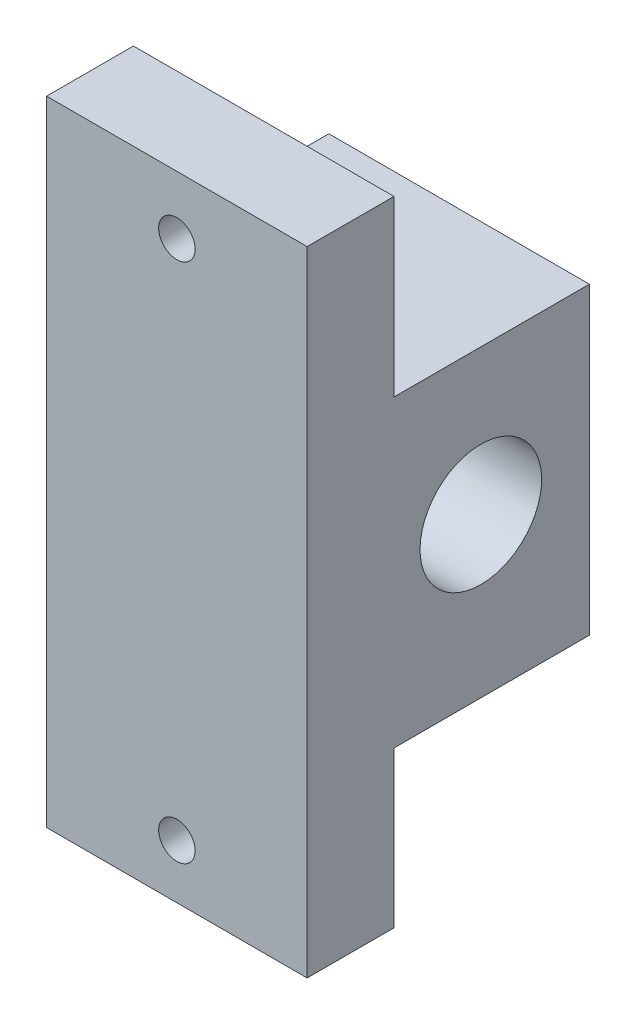
ISO-10303-21;
HEADER;
FILE_DESCRIPTION(('STEP AP214'),'2;1');
FILE_NAME('part.step','',(''),(''),'','','');
FILE_SCHEMA(('AUTOMOTIVE_DESIGN { 1 0 10303 214 1 1 1 1 }'));
ENDSEC;
DATA;
#1=APPLICATION_CONTEXT('core data for automotive mechanical design processes');
#2=APPLICATION_PROTOCOL_DEFINITION('international standard','automotive_design',2000,#1);
#3=PRODUCT_CONTEXT('',#1,'mechanical');
#4=PRODUCT('Part','Part','',(#3));
#5=PRODUCT_RELATED_PRODUCT_CATEGORY('part','',(#4));
#6=PRODUCT_DEFINITION_FORMATION('','',#4);
#7=PRODUCT_DEFINITION_CONTEXT('part definition',#1,'design');
#8=PRODUCT_DEFINITION('design','',#6,#7);
#9=PRODUCT_DEFINITION_SHAPE('','',#8);
#10=(LENGTH_UNIT() NAMED_UNIT(*) SI_UNIT(.MILLI.,.METRE.));
#11=(NAMED_UNIT(*) PLANE_ANGLE_UNIT() SI_UNIT($,.RADIAN.));
#12=(NAMED_UNIT(*) SI_UNIT($,.STERADIAN.) SOLID_ANGLE_UNIT());
#13=UNCERTAINTY_MEASURE_WITH_UNIT(LENGTH_MEASURE(1.E-05),#10,'distance_accuracy_value','');
#14=(GEOMETRIC_REPRESENTATION_CONTEXT(3) GLOBAL_UNCERTAINTY_ASSIGNED_CONTEXT((#13)) GLOBAL_UNIT_ASSIGNED_CONTEXT((#10,
#11,#12)) REPRESENTATION_CONTEXT('',''));
#15=CARTESIAN_POINT('',(0.,0.,0.));
#16=DIRECTION('',(0.,0.,1.));
#17=DIRECTION('',(1.,0.,0.));
#18=AXIS2_PLACEMENT_3D('',#15,#16,#17);
#19=CARTESIAN_POINT('',(63.,47.5,0.));
#20=DIRECTION('',(0.,0.,1.));
#21=DIRECTION('',(1.,0.,0.));
#22=AXIS2_PLACEMENT_3D('',#19,#20,#21);
#23=CYLINDRICAL_SURFACE('',#22,2.09999999999999);
#24=CARTESIAN_POINT('',(63.,47.5,0.));
#25=DIRECTION('',(0.,0.,1.));
#26=DIRECTION('',(1.,0.,0.));
#27=AXIS2_PLACEMENT_3D('',#24,#25,#26);
#28=CIRCLE('',#27,2.09999999999999);
#29=CARTESIAN_POINT('',(65.1,47.5,0.));
#30=VERTEX_POINT('',#29);
#31=EDGE_CURVE('E304',#30,#30,#28,.T.);
#32=ORIENTED_EDGE('',*,*,#31,.T.);
#33=EDGE_LOOP('',(#32));
#34=FACE_BOUND('',#33,.T.);
#35=CARTESIAN_POINT('',(63.,47.5,-10.));
#36=DIRECTION('',(0.,0.,1.));
#37=DIRECTION('',(1.,0.,0.));
#38=AXIS2_PLACEMENT_3D('',#35,#36,#37);
#39=CIRCLE('',#38,2.09999999999999);
#40=CARTESIAN_POINT('',(65.1,47.5,-10.));
#41=VERTEX_POINT('',#40);
#42=EDGE_CURVE('E308',#41,#41,#39,.T.);
#43=ORIENTED_EDGE('',*,*,#42,.F.);
#44=EDGE_LOOP('',(#43));
#45=FACE_BOUND('',#44,.T.);
#46=ADVANCED_FACE('F153',(#34,#45),#23,.F.);
#47=CARTESIAN_POINT('',(9.76548148508885,94.2084078711988,-10.));
#48=DIRECTION('',(0.,1.,0.));
#49=DIRECTION('',(0.,0.,1.));
#50=AXIS2_PLACEMENT_3D('',#47,#48,#49);
#51=PLANE('',#50);
#52=DIRECTION('',(0.,0.,1.));
#53=VECTOR('',#52,1.);
#54=CARTESIAN_POINT('',(78.,94.2084078711988,-10.));
#55=LINE('',#54,#53);
#56=CARTESIAN_POINT('',(78.,94.2084078711988,-32.5));
#57=VERTEX_POINT('',#56);
#58=CARTESIAN_POINT('',(78.,94.2084078711988,-10.));
#59=VERTEX_POINT('',#58);
#60=EDGE_CURVE('E281',#57,#59,#55,.T.);
#61=ORIENTED_EDGE('',*,*,#60,.F.);
#62=DIRECTION('',(1.,0.,0.));
#63=VECTOR('',#62,1.);
#64=CARTESIAN_POINT('',(9.76548148508885,94.2084078711988,-32.5));
#65=LINE('',#64,#63);
#66=CARTESIAN_POINT('',(48.,94.2084078711988,-32.5));
#67=VERTEX_POINT('',#66);
#68=EDGE_CURVE('E317',#67,#57,#65,.T.);
#69=ORIENTED_EDGE('',*,*,#68,.F.);
#70=DIRECTION('',(0.,0.,1.));
#71=VECTOR('',#70,1.);
#72=CARTESIAN_POINT('',(48.,94.2084078711988,-10.));
#73=LINE('',#72,#71);
#74=CARTESIAN_POINT('',(48.,94.2084078711988,-10.));
#75=VERTEX_POINT('',#74);
#76=EDGE_CURVE('E265',#67,#75,#73,.T.);
#77=ORIENTED_EDGE('',*,*,#76,.T.);
#78=DIRECTION('',(1.,0.,0.));
#79=VECTOR('',#78,1.);
#80=CARTESIAN_POINT('',(9.76548148508885,94.2084078711988,-10.));
#81=LINE('',#80,#79);
#82=EDGE_CURVE('E321',#75,#59,#81,.T.);
#83=ORIENTED_EDGE('',*,*,#82,.T.);
#84=EDGE_LOOP('',(#61,#69,#77,#83));
#85=FACE_BOUND('',#84,.T.);
#86=ADVANCED_FACE('F339',(#85),#51,.T.);
#87=CARTESIAN_POINT('',(0.,0.,-10.));
#88=DIRECTION('',(0.,0.,-1.));
#89=DIRECTION('',(-1.,0.,0.));
#90=AXIS2_PLACEMENT_3D('',#87,#88,#89);
#91=PLANE('',#90);
#92=DIRECTION('',(0.,1.,0.));
#93=VECTOR('',#92,1.);
#94=CARTESIAN_POINT('',(78.,0.,-10.));
#95=LINE('',#94,#93);
#96=CARTESIAN_POINT('',(78.,114.209562790698,-10.));
#97=VERTEX_POINT('',#96);
#98=EDGE_CURVE('E221',#59,#97,#95,.T.);
#99=ORIENTED_EDGE('',*,*,#98,.F.);
#100=ORIENTED_EDGE('',*,*,#82,.F.);
#101=DIRECTION('',(0.,1.,0.));
#102=VECTOR('',#101,1.);
#103=CARTESIAN_POINT('',(48.,0.,-10.));
#104=LINE('',#103,#102);
#105=CARTESIAN_POINT('',(48.,114.209562790698,-10.));
#106=VERTEX_POINT('',#105);
#107=EDGE_CURVE('E269',#75,#106,#104,.T.);
#108=ORIENTED_EDGE('',*,*,#107,.T.);
#109=DIRECTION('',(-1.,0.,0.));
#110=VECTOR('',#109,1.);
#111=CARTESIAN_POINT('',(0.,114.209562790698,-10.));
#112=LINE('',#111,#110);
#113=EDGE_CURVE('E293',#97,#106,#112,.T.);
#114=ORIENTED_EDGE('',*,*,#113,.F.);
#115=EDGE_LOOP('',(#99,#100,#108,#114));
#116=FACE_BOUND('',#115,.T.);
#117=CARTESIAN_POINT('',(63.,107.5,-10.));
#118=DIRECTION('',(0.,0.,-1.));
#119=DIRECTION('',(-1.,0.,0.));
#120=AXIS2_PLACEMENT_3D('',#117,#118,#119);
#121=CIRCLE('',#120,2.09999999999999);
#122=CARTESIAN_POINT('',(60.9,107.5,-10.));
#123=VERTEX_POINT('',#122);
#124=EDGE_CURVE('E300',#123,#123,#121,.T.);
#125=ORIENTED_EDGE('',*,*,#124,.F.);
#126=EDGE_LOOP('',(#125));
#127=FACE_BOUND('',#126,.T.);
#128=ADVANCED_FACE('F342',(#116,#127),#91,.T.);
#129=CARTESIAN_POINT('',(9.76548148508885,59.2040660269679,-10.));
#130=DIRECTION('',(0.,-1.,0.));
#131=DIRECTION('',(0.,0.,-1.));
#132=AXIS2_PLACEMENT_3D('',#129,#130,#131);
#133=PLANE('',#132);
#134=DIRECTION('',(0.,0.,-1.));
#135=VECTOR('',#134,1.);
#136=CARTESIAN_POINT('',(78.,59.2040660269679,-10.));
#137=LINE('',#136,#135);
#138=CARTESIAN_POINT('',(78.,59.2040660269679,-10.));
#139=VERTEX_POINT('',#138);
#140=CARTESIAN_POINT('',(78.,59.2040660269679,-32.5));
#141=VERTEX_POINT('',#140);
#142=EDGE_CURVE('E12',#139,#141,#137,.T.);
#143=ORIENTED_EDGE('',*,*,#142,.F.);
#144=DIRECTION('',(1.,0.,0.));
#145=VECTOR('',#144,1.);
#146=CARTESIAN_POINT('',(9.76548148508885,59.2040660269679,-10.));
#147=LINE('',#146,#145);
#148=CARTESIAN_POINT('',(48.,59.2040660269679,-10.));
#149=VERTEX_POINT('',#148);
#150=EDGE_CURVE('E312',#149,#139,#147,.T.);
#151=ORIENTED_EDGE('',*,*,#150,.F.);
#152=DIRECTION('',(0.,0.,-1.));
#153=VECTOR('',#152,1.);
#154=CARTESIAN_POINT('',(48.,59.2040660269679,-10.));
#155=LINE('',#154,#153);
#156=CARTESIAN_POINT('',(48.,59.2040660269679,-32.5));
#157=VERTEX_POINT('',#156);
#158=EDGE_CURVE('E162',#149,#157,#155,.T.);
#159=ORIENTED_EDGE('',*,*,#158,.T.);
#160=DIRECTION('',(1.,0.,0.));
#161=VECTOR('',#160,1.);
#162=CARTESIAN_POINT('',(9.76548148508885,59.2040660269679,-32.5));
#163=LINE('',#162,#161);
#164=EDGE_CURVE('E313',#157,#141,#163,.T.);
#165=ORIENTED_EDGE('',*,*,#164,.T.);
#166=EDGE_LOOP('',(#143,#151,#159,#165));
#167=FACE_BOUND('',#166,.T.);
#168=ADVANCED_FACE('F332',(#167),#133,.T.);
#169=CARTESIAN_POINT('',(0.,0.,-10.));
#170=DIRECTION('',(0.,0.,1.));
#171=DIRECTION('',(1.,0.,0.));
#172=AXIS2_PLACEMENT_3D('',#169,#170,#171);
#173=PLANE('',#172);
#174=ORIENTED_EDGE('',*,*,#42,.T.);
#175=EDGE_LOOP('',(#174));
#176=FACE_BOUND('',#175,.T.);
#177=ORIENTED_EDGE('',*,*,#150,.T.);
#178=DIRECTION('',(0.,-1.,0.));
#179=VECTOR('',#178,1.);
#180=CARTESIAN_POINT('',(78.,0.,-10.));
#181=LINE('',#180,#179);
#182=CARTESIAN_POINT('',(78.,41.2717166368517,-10.));
#183=VERTEX_POINT('',#182);
#184=EDGE_CURVE('E277',#139,#183,#181,.T.);
#185=ORIENTED_EDGE('',*,*,#184,.T.);
#186=DIRECTION('',(1.,0.,0.));
#187=VECTOR('',#186,1.);
#188=CARTESIAN_POINT('',(0.,41.2717166368517,-10.));
#189=LINE('',#188,#187);
#190=CARTESIAN_POINT('',(48.,41.2717166368517,-10.));
#191=VERTEX_POINT('',#190);
#192=EDGE_CURVE('E290',#191,#183,#189,.T.);
#193=ORIENTED_EDGE('',*,*,#192,.F.);
#194=DIRECTION('',(0.,-1.,0.));
#195=VECTOR('',#194,1.);
#196=CARTESIAN_POINT('',(48.,0.,-10.));
#197=LINE('',#196,#195);
#198=EDGE_CURVE('E262',#149,#191,#197,.T.);
#199=ORIENTED_EDGE('',*,*,#198,.F.);
#200=EDGE_LOOP('',(#177,#185,#193,#199));
#201=FACE_BOUND('',#200,.T.);
#202=ADVANCED_FACE('F350',(#176,#201),#173,.F.);
#203=CARTESIAN_POINT('',(134.003048667142,90.,-32.5));
#204=DIRECTION('',(0.,0.,-1.));
#205=DIRECTION('',(-1.,0.,0.));
#206=AXIS2_PLACEMENT_3D('',#203,#204,#205);
#207=PLANE('',#206);
#208=DIRECTION('',(0.,-1.,0.));
#209=VECTOR('',#208,1.);
#210=CARTESIAN_POINT('',(78.,114.209562790698,-32.5));
#211=LINE('',#210,#209);
#212=EDGE_CURVE('E254',#57,#141,#211,.T.);
#213=ORIENTED_EDGE('',*,*,#212,.T.);
#214=ORIENTED_EDGE('',*,*,#164,.F.);
#215=DIRECTION('',(0.,-1.,0.));
#216=VECTOR('',#215,1.);
#217=CARTESIAN_POINT('',(48.,114.209562790698,-32.5));
#218=LINE('',#217,#216);
#219=EDGE_CURVE('E177',#67,#157,#218,.T.);
#220=ORIENTED_EDGE('',*,*,#219,.F.);
#221=ORIENTED_EDGE('',*,*,#68,.T.);
#222=EDGE_LOOP('',(#213,#214,#220,#221));
#223=FACE_BOUND('',#222,.T.);
#224=ADVANCED_FACE('F335',(#223),#207,.T.);
#225=CARTESIAN_POINT('',(63.,107.5,0.));
#226=DIRECTION('',(0.,0.,1.));
#227=DIRECTION('',(1.,0.,0.));
#228=AXIS2_PLACEMENT_3D('',#225,#226,#227);
#229=CYLINDRICAL_SURFACE('',#228,2.09999999999999);
#230=ORIENTED_EDGE('',*,*,#124,.T.);
#231=EDGE_LOOP('',(#230));
#232=FACE_BOUND('',#231,.T.);
#233=CARTESIAN_POINT('',(63.,107.5,0.));
#234=DIRECTION('',(0.,0.,1.));
#235=DIRECTION('',(1.,0.,0.));
#236=AXIS2_PLACEMENT_3D('',#233,#234,#235);
#237=CIRCLE('',#236,2.09999999999999);
#238=CARTESIAN_POINT('',(65.1,107.5,0.));
#239=VERTEX_POINT('',#238);
#240=EDGE_CURVE('E296',#239,#239,#237,.T.);
#241=ORIENTED_EDGE('',*,*,#240,.T.);
#242=EDGE_LOOP('',(#241));
#243=FACE_BOUND('',#242,.T.);
#244=ADVANCED_FACE('F358',(#232,#243),#229,.F.);
#245=CARTESIAN_POINT('',(0.,0.,0.));
#246=DIRECTION('',(0.,0.,1.));
#247=DIRECTION('',(1.,0.,0.));
#248=AXIS2_PLACEMENT_3D('',#245,#246,#247);
#249=PLANE('',#248);
#250=DIRECTION('',(0.,-1.,0.));
#251=VECTOR('',#250,1.);
#252=CARTESIAN_POINT('',(78.,114.209562790698,0.));
#253=LINE('',#252,#251);
#254=CARTESIAN_POINT('',(78.,114.209562790698,0.));
#255=VERTEX_POINT('',#254);
#256=CARTESIAN_POINT('',(78.,41.2717166368517,0.));
#257=VERTEX_POINT('',#256);
#258=EDGE_CURVE('E169',#255,#257,#253,.T.);
#259=ORIENTED_EDGE('',*,*,#258,.F.);
#260=DIRECTION('',(1.,0.,0.));
#261=VECTOR('',#260,1.);
#262=CARTESIAN_POINT('',(48.,114.209562790698,0.));
#263=LINE('',#262,#261);
#264=CARTESIAN_POINT('',(48.,114.209562790698,0.));
#265=VERTEX_POINT('',#264);
#266=EDGE_CURVE('E229',#265,#255,#263,.T.);
#267=ORIENTED_EDGE('',*,*,#266,.F.);
#268=DIRECTION('',(0.,-1.,0.));
#269=VECTOR('',#268,1.);
#270=CARTESIAN_POINT('',(48.,114.209562790698,0.));
#271=LINE('',#270,#269);
#272=CARTESIAN_POINT('',(48.,41.2717166368517,0.));
#273=VERTEX_POINT('',#272);
#274=EDGE_CURVE('E236',#265,#273,#271,.T.);
#275=ORIENTED_EDGE('',*,*,#274,.T.);
#276=DIRECTION('',(1.,0.,0.));
#277=VECTOR('',#276,1.);
#278=CARTESIAN_POINT('',(48.,41.2717166368517,0.));
#279=LINE('',#278,#277);
#280=EDGE_CURVE('E242',#273,#257,#279,.T.);
#281=ORIENTED_EDGE('',*,*,#280,.T.);
#282=EDGE_LOOP('',(#259,#267,#275,#281));
#283=FACE_BOUND('',#282,.T.);
#284=ORIENTED_EDGE('',*,*,#240,.F.);
#285=EDGE_LOOP('',(#284));
#286=FACE_BOUND('',#285,.T.);
#287=ORIENTED_EDGE('',*,*,#31,.F.);
#288=EDGE_LOOP('',(#287));
#289=FACE_BOUND('',#288,.T.);
#290=ADVANCED_FACE('F239',(#283,#286,#289),#249,.T.);
#291=CARTESIAN_POINT('',(48.,41.2717166368517,-154.60116193694));
#292=DIRECTION('',(0.,-1.,0.));
#293=DIRECTION('',(1.,0.,0.));
#294=AXIS2_PLACEMENT_3D('',#291,#292,#293);
#295=PLANE('',#294);
#296=ORIENTED_EDGE('',*,*,#192,.T.);
#297=DIRECTION('',(0.,0.,1.));
#298=VECTOR('',#297,1.);
#299=CARTESIAN_POINT('',(78.,41.2717166368517,-154.60116193694));
#300=LINE('',#299,#298);
#301=EDGE_CURVE('E226',#183,#257,#300,.T.);
#302=ORIENTED_EDGE('',*,*,#301,.T.);
#303=ORIENTED_EDGE('',*,*,#280,.F.);
#304=DIRECTION('',(0.,0.,1.));
#305=VECTOR('',#304,1.);
#306=CARTESIAN_POINT('',(48.,41.2717166368517,-154.60116193694));
#307=LINE('',#306,#305);
#308=EDGE_CURVE('E251',#191,#273,#307,.T.);
#309=ORIENTED_EDGE('',*,*,#308,.F.);
#310=EDGE_LOOP('',(#296,#302,#303,#309));
#311=FACE_BOUND('',#310,.T.);
#312=ADVANCED_FACE('F348',(#311),#295,.T.);
#313=CARTESIAN_POINT('',(78.,114.209562790698,-154.60116193694));
#314=DIRECTION('',(-1.,0.,0.));
#315=DIRECTION('',(0.,-1.,0.));
#316=AXIS2_PLACEMENT_3D('',#313,#314,#315);
#317=PLANE('',#316);
#318=CARTESIAN_POINT('',(78.,77.5,-20.));
#319=DIRECTION('',(-1.,0.,0.));
#320=DIRECTION('',(0.,-1.,0.));
#321=AXIS2_PLACEMENT_3D('',#318,#319,#320);
#322=CIRCLE('',#321,7.);
#323=CARTESIAN_POINT('',(78.,70.5,-20.));
#324=VERTEX_POINT('',#323);
#325=EDGE_CURVE('E286',#324,#324,#322,.T.);
#326=ORIENTED_EDGE('',*,*,#325,.T.);
#327=EDGE_LOOP('',(#326));
#328=FACE_BOUND('',#327,.T.);
#329=ORIENTED_EDGE('',*,*,#98,.T.);
#330=DIRECTION('',(0.,0.,1.));
#331=VECTOR('',#330,1.);
#332=CARTESIAN_POINT('',(78.,114.209562790698,-154.60116193694));
#333=LINE('',#332,#331);
#334=EDGE_CURVE('E217',#97,#255,#333,.T.);
#335=ORIENTED_EDGE('',*,*,#334,.T.);
#336=ORIENTED_EDGE('',*,*,#258,.T.);
#337=ORIENTED_EDGE('',*,*,#301,.F.);
#338=ORIENTED_EDGE('',*,*,#184,.F.);
#339=ORIENTED_EDGE('',*,*,#142,.T.);
#340=ORIENTED_EDGE('',*,*,#212,.F.);
#341=ORIENTED_EDGE('',*,*,#60,.T.);
#342=EDGE_LOOP('',(#329,#335,#336,#337,#338,#339,#340,#341));
#343=FACE_BOUND('',#342,.T.);
#344=ADVANCED_FACE('F219',(#328,#343),#317,.F.);
#345=CARTESIAN_POINT('',(48.,114.209562790698,-154.60116193694));
#346=DIRECTION('',(-1.,0.,0.));
#347=DIRECTION('',(0.,-1.,0.));
#348=AXIS2_PLACEMENT_3D('',#345,#346,#347);
#349=PLANE('',#348);
#350=CARTESIAN_POINT('',(48.,77.5,-20.));
#351=DIRECTION('',(-1.,0.,0.));
#352=DIRECTION('',(0.,-1.,0.));
#353=AXIS2_PLACEMENT_3D('',#350,#351,#352);
#354=CIRCLE('',#353,7.);
#355=CARTESIAN_POINT('',(48.,70.5,-20.));
#356=VERTEX_POINT('',#355);
#357=EDGE_CURVE('E273',#356,#356,#354,.T.);
#358=ORIENTED_EDGE('',*,*,#357,.F.);
#359=EDGE_LOOP('',(#358));
#360=FACE_BOUND('',#359,.T.);
#361=ORIENTED_EDGE('',*,*,#76,.F.);
#362=ORIENTED_EDGE('',*,*,#219,.T.);
#363=ORIENTED_EDGE('',*,*,#158,.F.);
#364=ORIENTED_EDGE('',*,*,#198,.T.);
#365=ORIENTED_EDGE('',*,*,#308,.T.);
#366=ORIENTED_EDGE('',*,*,#274,.F.);
#367=DIRECTION('',(0.,0.,1.));
#368=VECTOR('',#367,1.);
#369=CARTESIAN_POINT('',(48.,114.209562790698,-154.60116193694));
#370=LINE('',#369,#368);
#371=EDGE_CURVE('E225',#106,#265,#370,.T.);
#372=ORIENTED_EDGE('',*,*,#371,.F.);
#373=ORIENTED_EDGE('',*,*,#107,.F.);
#374=EDGE_LOOP('',(#361,#362,#363,#364,#365,#366,#372,#373));
#375=FACE_BOUND('',#374,.T.);
#376=ADVANCED_FACE('F344',(#360,#375),#349,.T.);
#377=CARTESIAN_POINT('',(48.,114.209562790698,-154.60116193694));
#378=DIRECTION('',(0.,-1.,0.));
#379=DIRECTION('',(0.,0.,-1.));
#380=AXIS2_PLACEMENT_3D('',#377,#378,#379);
#381=PLANE('',#380);
#382=ORIENTED_EDGE('',*,*,#113,.T.);
#383=ORIENTED_EDGE('',*,*,#371,.T.);
#384=ORIENTED_EDGE('',*,*,#266,.T.);
#385=ORIENTED_EDGE('',*,*,#334,.F.);
#386=EDGE_LOOP('',(#382,#383,#384,#385));
#387=FACE_BOUND('',#386,.T.);
#388=ADVANCED_FACE('F230',(#387),#381,.F.);
#389=CARTESIAN_POINT('',(33.,77.5,-20.));
#390=DIRECTION('',(1.,0.,0.));
#391=DIRECTION('',(0.,0.,-1.));
#392=AXIS2_PLACEMENT_3D('',#389,#390,#391);
#393=CYLINDRICAL_SURFACE('',#392,7.);
#394=ORIENTED_EDGE('',*,*,#325,.F.);
#395=EDGE_LOOP('',(#394));
#396=FACE_BOUND('',#395,.T.);
#397=ORIENTED_EDGE('',*,*,#357,.T.);
#398=EDGE_LOOP('',(#397));
#399=FACE_BOUND('',#398,.T.);
#400=ADVANCED_FACE('F155',(#396,#399),#393,.F.);
#401=CLOSED_SHELL('',(#46,#86,#128,#168,#202,#224,#244,#290,#312,#344,#376,#388,#400));
#402=MANIFOLD_SOLID_BREP('B2',#401);
#403=ADVANCED_BREP_SHAPE_REPRESENTATION('',(#18,#402),#14);
#404=SHAPE_DEFINITION_REPRESENTATION(#9,#403);
ENDSEC;
END-ISO-10303-21;
